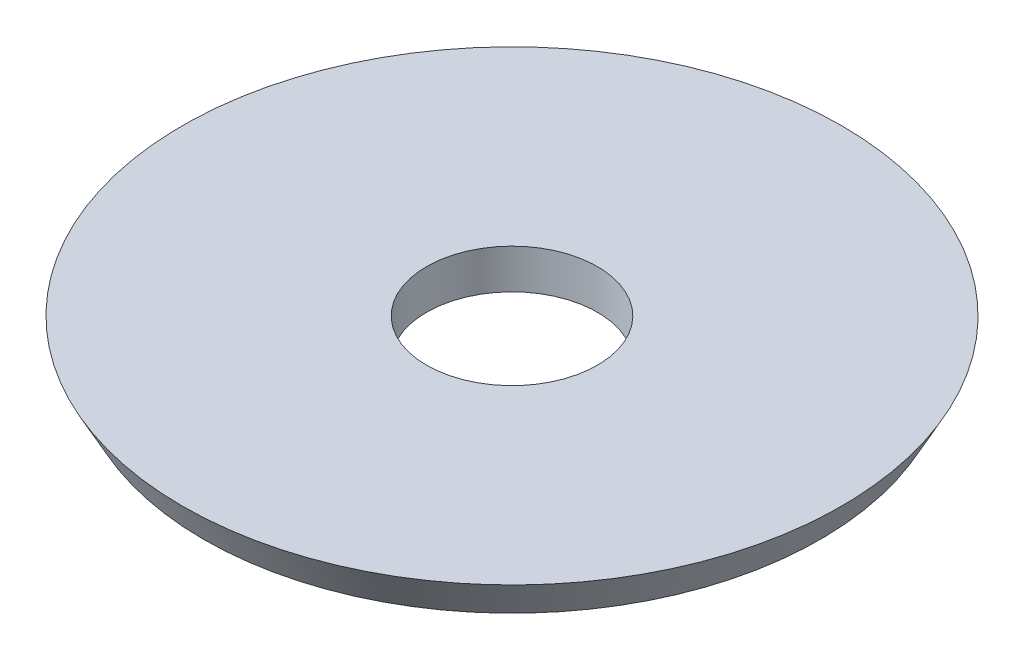
ISO-10303-21;
HEADER;
FILE_DESCRIPTION(('STEP AP214'),'2;1');
FILE_NAME('part.step','',(''),(''),'','','');
FILE_SCHEMA(('AUTOMOTIVE_DESIGN { 1 0 10303 214 1 1 1 1 }'));
ENDSEC;
DATA;
#1=APPLICATION_CONTEXT('core data for automotive mechanical design processes');
#2=APPLICATION_PROTOCOL_DEFINITION('international standard','automotive_design',2000,#1);
#3=PRODUCT_CONTEXT('',#1,'mechanical');
#4=PRODUCT('Part','Part','',(#3));
#5=PRODUCT_RELATED_PRODUCT_CATEGORY('part','',(#4));
#6=PRODUCT_DEFINITION_FORMATION('','',#4);
#7=PRODUCT_DEFINITION_CONTEXT('part definition',#1,'design');
#8=PRODUCT_DEFINITION('design','',#6,#7);
#9=PRODUCT_DEFINITION_SHAPE('','',#8);
#10=(LENGTH_UNIT() NAMED_UNIT(*) SI_UNIT(.MILLI.,.METRE.));
#11=(NAMED_UNIT(*) PLANE_ANGLE_UNIT() SI_UNIT($,.RADIAN.));
#12=(NAMED_UNIT(*) SI_UNIT($,.STERADIAN.) SOLID_ANGLE_UNIT());
#13=UNCERTAINTY_MEASURE_WITH_UNIT(LENGTH_MEASURE(1.E-05),#10,'distance_accuracy_value','');
#14=(GEOMETRIC_REPRESENTATION_CONTEXT(3) GLOBAL_UNCERTAINTY_ASSIGNED_CONTEXT((#13)) GLOBAL_UNIT_ASSIGNED_CONTEXT((#10,
#11,#12)) REPRESENTATION_CONTEXT('',''));
#15=CARTESIAN_POINT('',(0.,0.,0.));
#16=DIRECTION('',(0.,0.,1.));
#17=DIRECTION('',(1.,0.,0.));
#18=AXIS2_PLACEMENT_3D('',#15,#16,#17);
#19=CARTESIAN_POINT('',(0.,1.39,0.));
#20=DIRECTION('',(0.,1.,0.));
#21=DIRECTION('',(0.,0.,1.));
#22=AXIS2_PLACEMENT_3D('',#19,#20,#21);
#23=PLANE('',#22);
#24=CARTESIAN_POINT('',(0.,1.39,0.));
#25=DIRECTION('',(0.,1.,0.));
#26=DIRECTION('',(0.,0.,1.));
#27=AXIS2_PLACEMENT_3D('',#24,#25,#26);
#28=CIRCLE('',#27,3.);
#29=CARTESIAN_POINT('',(0.,1.39,3.));
#30=VERTEX_POINT('',#29);
#31=EDGE_CURVE('E62',#30,#30,#28,.T.);
#32=ORIENTED_EDGE('',*,*,#31,.F.);
#33=EDGE_LOOP('',(#32));
#34=FACE_BOUND('',#33,.T.);
#35=CARTESIAN_POINT('',(0.,1.39,0.));
#36=DIRECTION('',(0.,1.,0.));
#37=DIRECTION('',(0.,0.,1.));
#38=AXIS2_PLACEMENT_3D('',#35,#36,#37);
#39=CIRCLE('',#38,11.57);
#40=CARTESIAN_POINT('',(0.,1.39,11.57));
#41=VERTEX_POINT('',#40);
#42=EDGE_CURVE('E11',#41,#41,#39,.T.);
#43=ORIENTED_EDGE('',*,*,#42,.T.);
#44=EDGE_LOOP('',(#43));
#45=FACE_BOUND('',#44,.T.);
#46=ADVANCED_FACE('F39',(#34,#45),#23,.T.);
#47=CARTESIAN_POINT('',(0.,0.,0.));
#48=DIRECTION('',(0.,1.,0.));
#49=DIRECTION('',(0.,0.,1.));
#50=AXIS2_PLACEMENT_3D('',#47,#48,#49);
#51=PLANE('',#50);
#52=CARTESIAN_POINT('',(0.,0.,0.));
#53=DIRECTION('',(0.,1.,0.));
#54=DIRECTION('',(0.,0.,1.));
#55=AXIS2_PLACEMENT_3D('',#52,#53,#54);
#56=CIRCLE('',#55,3.);
#57=CARTESIAN_POINT('',(0.,0.,3.));
#58=VERTEX_POINT('',#57);
#59=EDGE_CURVE('E56',#58,#58,#56,.T.);
#60=ORIENTED_EDGE('',*,*,#59,.T.);
#61=EDGE_LOOP('',(#60));
#62=FACE_BOUND('',#61,.T.);
#63=CARTESIAN_POINT('',(0.,0.,0.));
#64=DIRECTION('',(0.,1.,0.));
#65=DIRECTION('',(0.,0.,1.));
#66=AXIS2_PLACEMENT_3D('',#63,#64,#65);
#67=CIRCLE('',#66,10.82);
#68=CARTESIAN_POINT('',(0.,0.,10.82));
#69=VERTEX_POINT('',#68);
#70=EDGE_CURVE('E48',#69,#69,#67,.T.);
#71=ORIENTED_EDGE('',*,*,#70,.F.);
#72=EDGE_LOOP('',(#71));
#73=FACE_BOUND('',#72,.T.);
#74=ADVANCED_FACE('F77',(#62,#73),#51,.F.);
#75=CARTESIAN_POINT('',(0.,0.,0.));
#76=DIRECTION('',(0.,1.,0.));
#77=DIRECTION('',(0.,0.,1.));
#78=AXIS2_PLACEMENT_3D('',#75,#76,#77);
#79=CONICAL_SURFACE('',#78,10.82,0.494799001642413);
#80=ORIENTED_EDGE('',*,*,#70,.T.);
#81=EDGE_LOOP('',(#80));
#82=FACE_BOUND('',#81,.T.);
#83=ORIENTED_EDGE('',*,*,#42,.F.);
#84=EDGE_LOOP('',(#83));
#85=FACE_BOUND('',#84,.T.);
#86=ADVANCED_FACE('F86',(#82,#85),#79,.T.);
#87=CARTESIAN_POINT('',(0.,-1.61,0.));
#88=DIRECTION('',(0.,1.,0.));
#89=DIRECTION('',(0.,0.,1.));
#90=AXIS2_PLACEMENT_3D('',#87,#88,#89);
#91=CYLINDRICAL_SURFACE('',#90,3.);
#92=ORIENTED_EDGE('',*,*,#31,.T.);
#93=EDGE_LOOP('',(#92));
#94=FACE_BOUND('',#93,.T.);
#95=ORIENTED_EDGE('',*,*,#59,.F.);
#96=EDGE_LOOP('',(#95));
#97=FACE_BOUND('',#96,.T.);
#98=ADVANCED_FACE('F88',(#94,#97),#91,.F.);
#99=CLOSED_SHELL('',(#46,#74,#86,#98));
#100=MANIFOLD_SOLID_BREP('B2',#99);
#101=ADVANCED_BREP_SHAPE_REPRESENTATION('',(#18,#100),#14);
#102=SHAPE_DEFINITION_REPRESENTATION(#9,#101);
ENDSEC;
END-ISO-10303-21;
